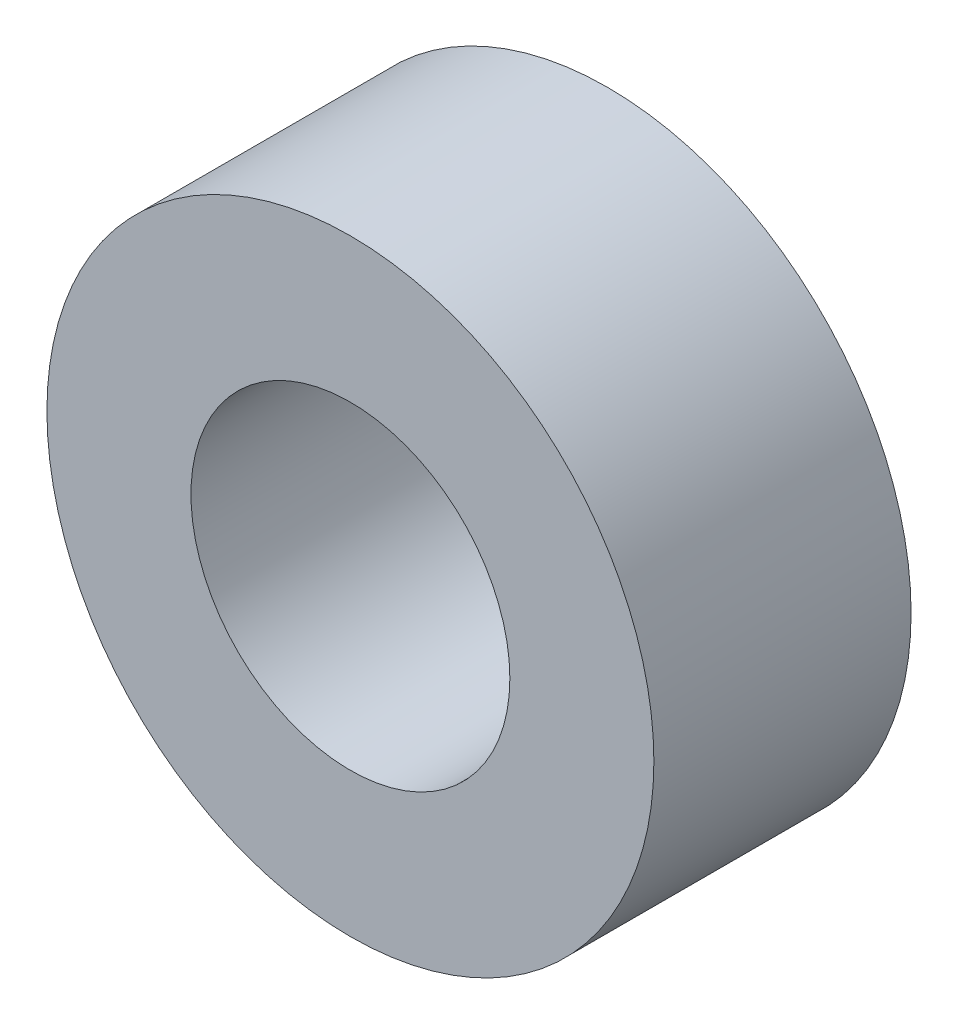
ISO-10303-21;
HEADER;
FILE_DESCRIPTION(('STEP AP214'),'2;1');
FILE_NAME('part.step','',(''),(''),'','','');
FILE_SCHEMA(('AUTOMOTIVE_DESIGN { 1 0 10303 214 1 1 1 1 }'));
ENDSEC;
DATA;
#1=APPLICATION_CONTEXT('core data for automotive mechanical design processes');
#2=APPLICATION_PROTOCOL_DEFINITION('international standard','automotive_design',2000,#1);
#3=PRODUCT_CONTEXT('',#1,'mechanical');
#4=PRODUCT('Part','Part','',(#3));
#5=PRODUCT_RELATED_PRODUCT_CATEGORY('part','',(#4));
#6=PRODUCT_DEFINITION_FORMATION('','',#4);
#7=PRODUCT_DEFINITION_CONTEXT('part definition',#1,'design');
#8=PRODUCT_DEFINITION('design','',#6,#7);
#9=PRODUCT_DEFINITION_SHAPE('','',#8);
#10=(LENGTH_UNIT() NAMED_UNIT(*) SI_UNIT(.MILLI.,.METRE.));
#11=(NAMED_UNIT(*) PLANE_ANGLE_UNIT() SI_UNIT($,.RADIAN.));
#12=(NAMED_UNIT(*) SI_UNIT($,.STERADIAN.) SOLID_ANGLE_UNIT());
#13=UNCERTAINTY_MEASURE_WITH_UNIT(LENGTH_MEASURE(1.E-05),#10,'distance_accuracy_value','');
#14=(GEOMETRIC_REPRESENTATION_CONTEXT(3) GLOBAL_UNCERTAINTY_ASSIGNED_CONTEXT((#13)) GLOBAL_UNIT_ASSIGNED_CONTEXT((#10,
#11,#12)) REPRESENTATION_CONTEXT('',''));
#15=CARTESIAN_POINT('',(0.,0.,0.));
#16=DIRECTION('',(0.,0.,1.));
#17=DIRECTION('',(1.,0.,0.));
#18=AXIS2_PLACEMENT_3D('',#15,#16,#17);
#19=CARTESIAN_POINT('',(0.,0.,5.));
#20=DIRECTION('',(0.,0.,1.));
#21=DIRECTION('',(1.,0.,0.));
#22=AXIS2_PLACEMENT_3D('',#19,#20,#21);
#23=PLANE('',#22);
#24=CARTESIAN_POINT('',(0.,0.,5.));
#25=DIRECTION('',(0.,0.,1.));
#26=DIRECTION('',(1.,0.,0.));
#27=AXIS2_PLACEMENT_3D('',#24,#25,#26);
#28=CIRCLE('',#27,5.9);
#29=CARTESIAN_POINT('',(5.9,0.,5.));
#30=VERTEX_POINT('',#29);
#31=EDGE_CURVE('E10',#30,#30,#28,.T.);
#32=ORIENTED_EDGE('',*,*,#31,.T.);
#33=EDGE_LOOP('',(#32));
#34=FACE_BOUND('',#33,.T.);
#35=CARTESIAN_POINT('',(0.,0.,5.));
#36=DIRECTION('',(0.,0.,1.));
#37=DIRECTION('',(1.,0.,0.));
#38=AXIS2_PLACEMENT_3D('',#35,#36,#37);
#39=CIRCLE('',#38,3.1);
#40=CARTESIAN_POINT('',(3.1,0.,5.));
#41=VERTEX_POINT('',#40);
#42=EDGE_CURVE('E42',#41,#41,#39,.T.);
#43=ORIENTED_EDGE('',*,*,#42,.F.);
#44=EDGE_LOOP('',(#43));
#45=FACE_BOUND('',#44,.T.);
#46=ADVANCED_FACE('F31',(#34,#45),#23,.T.);
#47=CARTESIAN_POINT('',(0.,0.,0.));
#48=DIRECTION('',(0.,0.,1.));
#49=DIRECTION('',(1.,0.,0.));
#50=AXIS2_PLACEMENT_3D('',#47,#48,#49);
#51=PLANE('',#50);
#52=CARTESIAN_POINT('',(0.,0.,0.));
#53=DIRECTION('',(0.,0.,1.));
#54=DIRECTION('',(1.,0.,0.));
#55=AXIS2_PLACEMENT_3D('',#52,#53,#54);
#56=CIRCLE('',#55,5.9);
#57=CARTESIAN_POINT('',(5.9,0.,0.));
#58=VERTEX_POINT('',#57);
#59=EDGE_CURVE('E35',#58,#58,#56,.T.);
#60=ORIENTED_EDGE('',*,*,#59,.F.);
#61=EDGE_LOOP('',(#60));
#62=FACE_BOUND('',#61,.T.);
#63=CARTESIAN_POINT('',(0.,0.,0.));
#64=DIRECTION('',(0.,0.,1.));
#65=DIRECTION('',(1.,0.,0.));
#66=AXIS2_PLACEMENT_3D('',#63,#64,#65);
#67=CIRCLE('',#66,3.1);
#68=CARTESIAN_POINT('',(3.1,0.,0.));
#69=VERTEX_POINT('',#68);
#70=EDGE_CURVE('E44',#69,#69,#67,.T.);
#71=ORIENTED_EDGE('',*,*,#70,.T.);
#72=EDGE_LOOP('',(#71));
#73=FACE_BOUND('',#72,.T.);
#74=ADVANCED_FACE('F54',(#62,#73),#51,.F.);
#75=CARTESIAN_POINT('',(0.,0.,5.));
#76=DIRECTION('',(0.,0.,-1.));
#77=DIRECTION('',(-1.,0.,0.));
#78=AXIS2_PLACEMENT_3D('',#75,#76,#77);
#79=CYLINDRICAL_SURFACE('',#78,5.9);
#80=ORIENTED_EDGE('',*,*,#31,.F.);
#81=EDGE_LOOP('',(#80));
#82=FACE_BOUND('',#81,.T.);
#83=ORIENTED_EDGE('',*,*,#59,.T.);
#84=EDGE_LOOP('',(#83));
#85=FACE_BOUND('',#84,.T.);
#86=ADVANCED_FACE('F33',(#82,#85),#79,.T.);
#87=CARTESIAN_POINT('',(0.,0.,5.));
#88=DIRECTION('',(0.,0.,-1.));
#89=DIRECTION('',(-1.,0.,0.));
#90=AXIS2_PLACEMENT_3D('',#87,#88,#89);
#91=CYLINDRICAL_SURFACE('',#90,3.1);
#92=ORIENTED_EDGE('',*,*,#42,.T.);
#93=EDGE_LOOP('',(#92));
#94=FACE_BOUND('',#93,.T.);
#95=ORIENTED_EDGE('',*,*,#70,.F.);
#96=EDGE_LOOP('',(#95));
#97=FACE_BOUND('',#96,.T.);
#98=ADVANCED_FACE('F50',(#94,#97),#91,.F.);
#99=CLOSED_SHELL('',(#46,#74,#86,#98));
#100=MANIFOLD_SOLID_BREP('B2',#99);
#101=ADVANCED_BREP_SHAPE_REPRESENTATION('',(#18,#100),#14);
#102=SHAPE_DEFINITION_REPRESENTATION(#9,#101);
ENDSEC;
END-ISO-10303-21;
